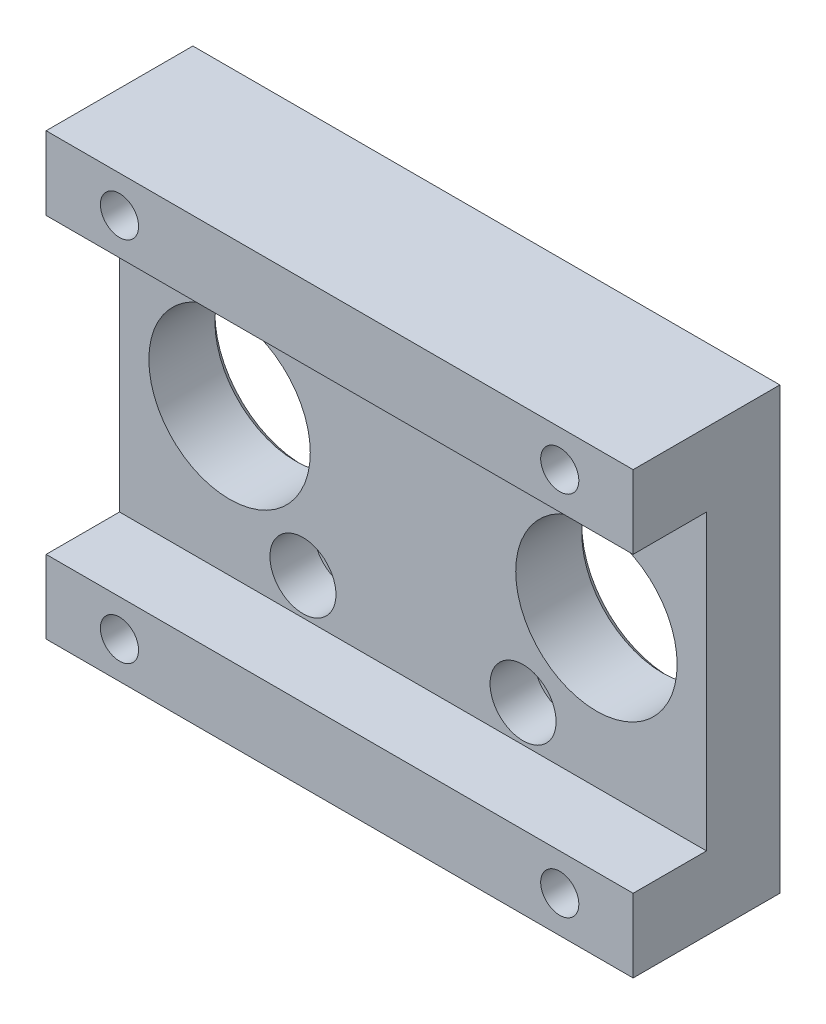
ISO-10303-21;
HEADER;
FILE_DESCRIPTION(('STEP AP214'),'2;1');
FILE_NAME('part.step','',(''),(''),'','','');
FILE_SCHEMA(('AUTOMOTIVE_DESIGN { 1 0 10303 214 1 1 1 1 }'));
ENDSEC;
DATA;
#1=APPLICATION_CONTEXT('core data for automotive mechanical design processes');
#2=APPLICATION_PROTOCOL_DEFINITION('international standard','automotive_design',2000,#1);
#3=PRODUCT_CONTEXT('',#1,'mechanical');
#4=PRODUCT('Part','Part','',(#3));
#5=PRODUCT_RELATED_PRODUCT_CATEGORY('part','',(#4));
#6=PRODUCT_DEFINITION_FORMATION('','',#4);
#7=PRODUCT_DEFINITION_CONTEXT('part definition',#1,'design');
#8=PRODUCT_DEFINITION('design','',#6,#7);
#9=PRODUCT_DEFINITION_SHAPE('','',#8);
#10=(LENGTH_UNIT() NAMED_UNIT(*) SI_UNIT(.MILLI.,.METRE.));
#11=(NAMED_UNIT(*) PLANE_ANGLE_UNIT() SI_UNIT($,.RADIAN.));
#12=(NAMED_UNIT(*) SI_UNIT($,.STERADIAN.) SOLID_ANGLE_UNIT());
#13=UNCERTAINTY_MEASURE_WITH_UNIT(LENGTH_MEASURE(1.E-05),#10,'distance_accuracy_value','');
#14=(GEOMETRIC_REPRESENTATION_CONTEXT(3) GLOBAL_UNCERTAINTY_ASSIGNED_CONTEXT((#13)) GLOBAL_UNIT_ASSIGNED_CONTEXT((#10,
#11,#12)) REPRESENTATION_CONTEXT('',''));
#15=CARTESIAN_POINT('',(0.,0.,0.));
#16=DIRECTION('',(0.,0.,1.));
#17=DIRECTION('',(1.,0.,0.));
#18=AXIS2_PLACEMENT_3D('',#15,#16,#17);
#19=CARTESIAN_POINT('',(15.,15.,10.));
#20=DIRECTION('',(0.,0.,-1.));
#21=DIRECTION('',(-1.,0.,0.));
#22=AXIS2_PLACEMENT_3D('',#19,#20,#21);
#23=CYLINDRICAL_SURFACE('',#22,2.6);
#24=CARTESIAN_POINT('',(15.,15.,0.));
#25=DIRECTION('',(0.,0.,-1.));
#26=DIRECTION('',(-1.,0.,0.));
#27=AXIS2_PLACEMENT_3D('',#24,#25,#26);
#28=CIRCLE('',#27,2.6);
#29=CARTESIAN_POINT('',(12.4,15.,0.));
#30=VERTEX_POINT('',#29);
#31=EDGE_CURVE('E232',#30,#30,#28,.T.);
#32=ORIENTED_EDGE('',*,*,#31,.T.);
#33=EDGE_LOOP('',(#32));
#34=FACE_BOUND('',#33,.T.);
#35=CARTESIAN_POINT('',(15.,15.,4.));
#36=DIRECTION('',(0.,0.,1.));
#37=DIRECTION('',(1.,0.,0.));
#38=AXIS2_PLACEMENT_3D('',#35,#36,#37);
#39=CIRCLE('',#38,2.6);
#40=CARTESIAN_POINT('',(17.6,15.,4.));
#41=VERTEX_POINT('',#40);
#42=EDGE_CURVE('E56',#41,#41,#39,.F.);
#43=ORIENTED_EDGE('',*,*,#42,.F.);
#44=EDGE_LOOP('',(#43));
#45=FACE_BOUND('',#44,.T.);
#46=ADVANCED_FACE('F51',(#34,#45),#23,.F.);
#47=CARTESIAN_POINT('',(-15.,15.,10.));
#48=DIRECTION('',(0.,0.,-1.));
#49=DIRECTION('',(-1.,0.,0.));
#50=AXIS2_PLACEMENT_3D('',#47,#48,#49);
#51=CYLINDRICAL_SURFACE('',#50,2.6);
#52=CARTESIAN_POINT('',(-15.,15.,0.));
#53=DIRECTION('',(0.,0.,-1.));
#54=DIRECTION('',(-1.,0.,0.));
#55=AXIS2_PLACEMENT_3D('',#52,#53,#54);
#56=CIRCLE('',#55,2.6);
#57=CARTESIAN_POINT('',(-17.6,15.,0.));
#58=VERTEX_POINT('',#57);
#59=EDGE_CURVE('E228',#58,#58,#56,.T.);
#60=ORIENTED_EDGE('',*,*,#59,.T.);
#61=EDGE_LOOP('',(#60));
#62=FACE_BOUND('',#61,.T.);
#63=CARTESIAN_POINT('',(-15.,15.,4.));
#64=DIRECTION('',(0.,0.,1.));
#65=DIRECTION('',(1.,0.,0.));
#66=AXIS2_PLACEMENT_3D('',#63,#64,#65);
#67=CIRCLE('',#66,2.6);
#68=CARTESIAN_POINT('',(-12.4,15.,4.));
#69=VERTEX_POINT('',#68);
#70=EDGE_CURVE('E214',#69,#69,#67,.F.);
#71=ORIENTED_EDGE('',*,*,#70,.F.);
#72=EDGE_LOOP('',(#71));
#73=FACE_BOUND('',#72,.T.);
#74=ADVANCED_FACE('F299',(#62,#73),#51,.F.);
#75=CARTESIAN_POINT('',(-15.,-15.,10.));
#76=DIRECTION('',(0.,0.,-1.));
#77=DIRECTION('',(-1.,0.,0.));
#78=AXIS2_PLACEMENT_3D('',#75,#76,#77);
#79=CYLINDRICAL_SURFACE('',#78,2.6);
#80=CARTESIAN_POINT('',(-15.,-15.,0.));
#81=DIRECTION('',(0.,0.,-1.));
#82=DIRECTION('',(-1.,0.,0.));
#83=AXIS2_PLACEMENT_3D('',#80,#81,#82);
#84=CIRCLE('',#83,2.6);
#85=CARTESIAN_POINT('',(-17.6,-15.,0.));
#86=VERTEX_POINT('',#85);
#87=EDGE_CURVE('E223',#86,#86,#84,.T.);
#88=ORIENTED_EDGE('',*,*,#87,.T.);
#89=EDGE_LOOP('',(#88));
#90=FACE_BOUND('',#89,.T.);
#91=CARTESIAN_POINT('',(-15.,-15.,4.));
#92=DIRECTION('',(0.,0.,1.));
#93=DIRECTION('',(1.,0.,0.));
#94=AXIS2_PLACEMENT_3D('',#91,#92,#93);
#95=CIRCLE('',#94,2.6);
#96=CARTESIAN_POINT('',(-12.4,-15.,4.));
#97=VERTEX_POINT('',#96);
#98=EDGE_CURVE('E211',#97,#97,#95,.F.);
#99=ORIENTED_EDGE('',*,*,#98,.F.);
#100=EDGE_LOOP('',(#99));
#101=FACE_BOUND('',#100,.T.);
#102=ADVANCED_FACE('F306',(#90,#101),#79,.F.);
#103=CARTESIAN_POINT('',(15.,-15.,10.));
#104=DIRECTION('',(0.,0.,-1.));
#105=DIRECTION('',(-1.,0.,0.));
#106=AXIS2_PLACEMENT_3D('',#103,#104,#105);
#107=CYLINDRICAL_SURFACE('',#106,2.6);
#108=CARTESIAN_POINT('',(15.,-15.,0.));
#109=DIRECTION('',(0.,0.,-1.));
#110=DIRECTION('',(-1.,0.,0.));
#111=AXIS2_PLACEMENT_3D('',#108,#109,#110);
#112=CIRCLE('',#111,2.6);
#113=CARTESIAN_POINT('',(12.4,-15.,0.));
#114=VERTEX_POINT('',#113);
#115=EDGE_CURVE('E219',#114,#114,#112,.T.);
#116=ORIENTED_EDGE('',*,*,#115,.T.);
#117=EDGE_LOOP('',(#116));
#118=FACE_BOUND('',#117,.T.);
#119=CARTESIAN_POINT('',(15.,-15.,4.));
#120=DIRECTION('',(0.,0.,1.));
#121=DIRECTION('',(1.,0.,0.));
#122=AXIS2_PLACEMENT_3D('',#119,#120,#121);
#123=CIRCLE('',#122,2.6);
#124=CARTESIAN_POINT('',(17.6,-15.,4.));
#125=VERTEX_POINT('',#124);
#126=EDGE_CURVE('E208',#125,#125,#123,.F.);
#127=ORIENTED_EDGE('',*,*,#126,.F.);
#128=EDGE_LOOP('',(#127));
#129=FACE_BOUND('',#128,.T.);
#130=ADVANCED_FACE('F312',(#118,#129),#107,.F.);
#131=CARTESIAN_POINT('',(-30.,-25.,0.));
#132=DIRECTION('',(0.,0.,1.));
#133=DIRECTION('',(1.,0.,0.));
#134=AXIS2_PLACEMENT_3D('',#131,#132,#133);
#135=CYLINDRICAL_SURFACE('',#134,2.6);
#136=CARTESIAN_POINT('',(-30.,-25.,20.));
#137=DIRECTION('',(0.,0.,1.));
#138=DIRECTION('',(1.,0.,0.));
#139=AXIS2_PLACEMENT_3D('',#136,#137,#138);
#140=CIRCLE('',#139,2.6);
#141=CARTESIAN_POINT('',(-27.4,-25.,20.));
#142=VERTEX_POINT('',#141);
#143=EDGE_CURVE('E268',#142,#142,#140,.T.);
#144=ORIENTED_EDGE('',*,*,#143,.T.);
#145=EDGE_LOOP('',(#144));
#146=FACE_BOUND('',#145,.T.);
#147=CARTESIAN_POINT('',(-30.,-25.,5.3));
#148=DIRECTION('',(0.,0.,-1.));
#149=DIRECTION('',(-1.,0.,0.));
#150=AXIS2_PLACEMENT_3D('',#147,#148,#149);
#151=CIRCLE('',#150,2.6);
#152=CARTESIAN_POINT('',(-32.6,-25.,5.3));
#153=VERTEX_POINT('',#152);
#154=EDGE_CURVE('E204',#153,#153,#151,.F.);
#155=ORIENTED_EDGE('',*,*,#154,.F.);
#156=EDGE_LOOP('',(#155));
#157=FACE_BOUND('',#156,.T.);
#158=ADVANCED_FACE('F361',(#146,#157),#135,.F.);
#159=CARTESIAN_POINT('',(30.,-25.,0.));
#160=DIRECTION('',(0.,0.,1.));
#161=DIRECTION('',(1.,0.,0.));
#162=AXIS2_PLACEMENT_3D('',#159,#160,#161);
#163=CYLINDRICAL_SURFACE('',#162,2.6);
#164=CARTESIAN_POINT('',(30.,-25.,20.));
#165=DIRECTION('',(0.,0.,1.));
#166=DIRECTION('',(1.,0.,0.));
#167=AXIS2_PLACEMENT_3D('',#164,#165,#166);
#168=CIRCLE('',#167,2.6);
#169=CARTESIAN_POINT('',(32.6,-25.,20.));
#170=VERTEX_POINT('',#169);
#171=EDGE_CURVE('E261',#170,#170,#168,.T.);
#172=ORIENTED_EDGE('',*,*,#171,.T.);
#173=EDGE_LOOP('',(#172));
#174=FACE_BOUND('',#173,.T.);
#175=CARTESIAN_POINT('',(30.,-25.,5.3));
#176=DIRECTION('',(0.,0.,-1.));
#177=DIRECTION('',(-1.,0.,0.));
#178=AXIS2_PLACEMENT_3D('',#175,#176,#177);
#179=CIRCLE('',#178,2.6);
#180=CARTESIAN_POINT('',(27.4,-25.,5.3));
#181=VERTEX_POINT('',#180);
#182=EDGE_CURVE('E201',#181,#181,#179,.F.);
#183=ORIENTED_EDGE('',*,*,#182,.F.);
#184=EDGE_LOOP('',(#183));
#185=FACE_BOUND('',#184,.T.);
#186=ADVANCED_FACE('F364',(#174,#185),#163,.F.);
#187=CARTESIAN_POINT('',(30.,25.,0.));
#188=DIRECTION('',(0.,0.,1.));
#189=DIRECTION('',(1.,0.,0.));
#190=AXIS2_PLACEMENT_3D('',#187,#188,#189);
#191=CYLINDRICAL_SURFACE('',#190,2.6);
#192=CARTESIAN_POINT('',(30.,25.,20.));
#193=DIRECTION('',(0.,0.,1.));
#194=DIRECTION('',(1.,0.,0.));
#195=AXIS2_PLACEMENT_3D('',#192,#193,#194);
#196=CIRCLE('',#195,2.6);
#197=CARTESIAN_POINT('',(32.6,25.,20.));
#198=VERTEX_POINT('',#197);
#199=EDGE_CURVE('E267',#198,#198,#196,.T.);
#200=ORIENTED_EDGE('',*,*,#199,.T.);
#201=EDGE_LOOP('',(#200));
#202=FACE_BOUND('',#201,.T.);
#203=CARTESIAN_POINT('',(30.,25.,5.3));
#204=DIRECTION('',(0.,0.,-1.));
#205=DIRECTION('',(-1.,0.,0.));
#206=AXIS2_PLACEMENT_3D('',#203,#204,#205);
#207=CIRCLE('',#206,2.6);
#208=CARTESIAN_POINT('',(27.4,25.,5.3));
#209=VERTEX_POINT('',#208);
#210=EDGE_CURVE('E197',#209,#209,#207,.F.);
#211=ORIENTED_EDGE('',*,*,#210,.F.);
#212=EDGE_LOOP('',(#211));
#213=FACE_BOUND('',#212,.T.);
#214=ADVANCED_FACE('F359',(#202,#213),#191,.F.);
#215=CARTESIAN_POINT('',(-30.,25.,0.));
#216=DIRECTION('',(0.,0.,1.));
#217=DIRECTION('',(1.,0.,0.));
#218=AXIS2_PLACEMENT_3D('',#215,#216,#217);
#219=CYLINDRICAL_SURFACE('',#218,2.6);
#220=CARTESIAN_POINT('',(-30.,25.,20.));
#221=DIRECTION('',(0.,0.,1.));
#222=DIRECTION('',(1.,0.,0.));
#223=AXIS2_PLACEMENT_3D('',#220,#221,#222);
#224=CIRCLE('',#223,2.6);
#225=CARTESIAN_POINT('',(-27.4,25.,20.));
#226=VERTEX_POINT('',#225);
#227=EDGE_CURVE('E264',#226,#226,#224,.T.);
#228=ORIENTED_EDGE('',*,*,#227,.T.);
#229=EDGE_LOOP('',(#228));
#230=FACE_BOUND('',#229,.T.);
#231=CARTESIAN_POINT('',(-30.,25.,5.3));
#232=DIRECTION('',(0.,0.,-1.));
#233=DIRECTION('',(-1.,0.,0.));
#234=AXIS2_PLACEMENT_3D('',#231,#232,#233);
#235=CIRCLE('',#234,2.6);
#236=CARTESIAN_POINT('',(-32.6,25.,5.3));
#237=VERTEX_POINT('',#236);
#238=EDGE_CURVE('E194',#237,#237,#235,.F.);
#239=ORIENTED_EDGE('',*,*,#238,.F.);
#240=EDGE_LOOP('',(#239));
#241=FACE_BOUND('',#240,.T.);
#242=ADVANCED_FACE('F355',(#230,#241),#219,.F.);
#243=CARTESIAN_POINT('',(0.,0.,10.));
#244=DIRECTION('',(0.,0.,1.));
#245=DIRECTION('',(1.,0.,0.));
#246=AXIS2_PLACEMENT_3D('',#243,#244,#245);
#247=PLANE('',#246);
#248=CARTESIAN_POINT('',(15.,-15.,10.));
#249=DIRECTION('',(0.,0.,1.));
#250=DIRECTION('',(1.,0.,0.));
#251=AXIS2_PLACEMENT_3D('',#248,#249,#250);
#252=CIRCLE('',#251,4.5);
#253=CARTESIAN_POINT('',(19.5,-15.,10.));
#254=VERTEX_POINT('',#253);
#255=EDGE_CURVE('E431',#254,#254,#252,.T.);
#256=ORIENTED_EDGE('',*,*,#255,.F.);
#257=EDGE_LOOP('',(#256));
#258=FACE_BOUND('',#257,.T.);
#259=CARTESIAN_POINT('',(-15.,-15.,10.));
#260=DIRECTION('',(0.,0.,1.));
#261=DIRECTION('',(1.,0.,0.));
#262=AXIS2_PLACEMENT_3D('',#259,#260,#261);
#263=CIRCLE('',#262,4.5);
#264=CARTESIAN_POINT('',(-10.5,-15.,10.));
#265=VERTEX_POINT('',#264);
#266=EDGE_CURVE('E435',#265,#265,#263,.T.);
#267=ORIENTED_EDGE('',*,*,#266,.F.);
#268=EDGE_LOOP('',(#267));
#269=FACE_BOUND('',#268,.T.);
#270=CARTESIAN_POINT('',(-15.,15.,10.));
#271=DIRECTION('',(0.,0.,1.));
#272=DIRECTION('',(1.,0.,0.));
#273=AXIS2_PLACEMENT_3D('',#270,#271,#272);
#274=CIRCLE('',#273,4.5);
#275=CARTESIAN_POINT('',(-10.5,15.,10.));
#276=VERTEX_POINT('',#275);
#277=EDGE_CURVE('E439',#276,#276,#274,.T.);
#278=ORIENTED_EDGE('',*,*,#277,.F.);
#279=EDGE_LOOP('',(#278));
#280=FACE_BOUND('',#279,.T.);
#281=CARTESIAN_POINT('',(15.,15.,10.));
#282=DIRECTION('',(0.,0.,1.));
#283=DIRECTION('',(1.,0.,0.));
#284=AXIS2_PLACEMENT_3D('',#281,#282,#283);
#285=CIRCLE('',#284,4.5);
#286=CARTESIAN_POINT('',(19.5,15.,10.));
#287=VERTEX_POINT('',#286);
#288=EDGE_CURVE('E443',#287,#287,#285,.T.);
#289=ORIENTED_EDGE('',*,*,#288,.F.);
#290=EDGE_LOOP('',(#289));
#291=FACE_BOUND('',#290,.T.);
#292=CARTESIAN_POINT('',(-25.,0.,10.));
#293=DIRECTION('',(0.,0.,1.));
#294=DIRECTION('',(1.,0.,0.));
#295=AXIS2_PLACEMENT_3D('',#292,#293,#294);
#296=CIRCLE('',#295,11.);
#297=CARTESIAN_POINT('',(-14.,0.,10.));
#298=VERTEX_POINT('',#297);
#299=EDGE_CURVE('E258',#298,#298,#296,.T.);
#300=ORIENTED_EDGE('',*,*,#299,.F.);
#301=EDGE_LOOP('',(#300));
#302=FACE_BOUND('',#301,.T.);
#303=CARTESIAN_POINT('',(25.,0.,10.));
#304=DIRECTION('',(0.,0.,1.));
#305=DIRECTION('',(1.,0.,0.));
#306=AXIS2_PLACEMENT_3D('',#303,#304,#305);
#307=CIRCLE('',#306,11.);
#308=CARTESIAN_POINT('',(36.,0.,10.));
#309=VERTEX_POINT('',#308);
#310=EDGE_CURVE('E207',#309,#309,#307,.T.);
#311=ORIENTED_EDGE('',*,*,#310,.F.);
#312=EDGE_LOOP('',(#311));
#313=FACE_BOUND('',#312,.T.);
#314=DIRECTION('',(0.,-1.,0.));
#315=VECTOR('',#314,1.);
#316=CARTESIAN_POINT('',(-40.,30.,10.));
#317=LINE('',#316,#315);
#318=CARTESIAN_POINT('',(-40.,20.,10.));
#319=VERTEX_POINT('',#318);
#320=CARTESIAN_POINT('',(-40.,-20.,10.));
#321=VERTEX_POINT('',#320);
#322=EDGE_CURVE('E74',#319,#321,#317,.T.);
#323=ORIENTED_EDGE('',*,*,#322,.T.);
#324=DIRECTION('',(-1.,0.,0.));
#325=VECTOR('',#324,1.);
#326=CARTESIAN_POINT('',(40.,-20.,10.));
#327=LINE('',#326,#325);
#328=CARTESIAN_POINT('',(40.,-20.,10.));
#329=VERTEX_POINT('',#328);
#330=EDGE_CURVE('E69',#329,#321,#327,.T.);
#331=ORIENTED_EDGE('',*,*,#330,.F.);
#332=DIRECTION('',(0.,1.,0.));
#333=VECTOR('',#332,1.);
#334=CARTESIAN_POINT('',(40.,30.,10.));
#335=LINE('',#334,#333);
#336=CARTESIAN_POINT('',(40.,20.,10.));
#337=VERTEX_POINT('',#336);
#338=EDGE_CURVE('E170',#329,#337,#335,.T.);
#339=ORIENTED_EDGE('',*,*,#338,.T.);
#340=DIRECTION('',(1.,0.,0.));
#341=VECTOR('',#340,1.);
#342=CARTESIAN_POINT('',(-40.,20.,10.));
#343=LINE('',#342,#341);
#344=EDGE_CURVE('E145',#319,#337,#343,.T.);
#345=ORIENTED_EDGE('',*,*,#344,.F.);
#346=EDGE_LOOP('',(#323,#331,#339,#345));
#347=FACE_BOUND('',#346,.T.);
#348=ADVANCED_FACE('F358',(#258,#269,#280,#291,#302,#313,#347),#247,.T.);
#349=CARTESIAN_POINT('',(40.,30.,10.));
#350=DIRECTION('',(-1.,0.,0.));
#351=DIRECTION('',(0.,-1.,0.));
#352=AXIS2_PLACEMENT_3D('',#349,#350,#351);
#353=PLANE('',#352);
#354=DIRECTION('',(0.,1.,0.));
#355=VECTOR('',#354,1.);
#356=CARTESIAN_POINT('',(40.,30.,0.));
#357=LINE('',#356,#355);
#358=CARTESIAN_POINT('',(40.,-30.,0.));
#359=VERTEX_POINT('',#358);
#360=CARTESIAN_POINT('',(40.,30.,0.));
#361=VERTEX_POINT('',#360);
#362=EDGE_CURVE('E169',#359,#361,#357,.T.);
#363=ORIENTED_EDGE('',*,*,#362,.T.);
#364=DIRECTION('',(0.,0.,-1.));
#365=VECTOR('',#364,1.);
#366=CARTESIAN_POINT('',(40.,30.,10.));
#367=LINE('',#366,#365);
#368=CARTESIAN_POINT('',(40.,30.,20.));
#369=VERTEX_POINT('',#368);
#370=EDGE_CURVE('E183',#369,#361,#367,.T.);
#371=ORIENTED_EDGE('',*,*,#370,.F.);
#372=DIRECTION('',(0.,1.,0.));
#373=VECTOR('',#372,1.);
#374=CARTESIAN_POINT('',(40.,30.,20.));
#375=LINE('',#374,#373);
#376=CARTESIAN_POINT('',(40.,20.,20.));
#377=VERTEX_POINT('',#376);
#378=EDGE_CURVE('E155',#377,#369,#375,.T.);
#379=ORIENTED_EDGE('',*,*,#378,.F.);
#380=DIRECTION('',(0.,0.,-1.));
#381=VECTOR('',#380,1.);
#382=CARTESIAN_POINT('',(40.,20.,20.));
#383=LINE('',#382,#381);
#384=EDGE_CURVE('E161',#377,#337,#383,.T.);
#385=ORIENTED_EDGE('',*,*,#384,.T.);
#386=ORIENTED_EDGE('',*,*,#338,.F.);
#387=DIRECTION('',(0.,0.,-1.));
#388=VECTOR('',#387,1.);
#389=CARTESIAN_POINT('',(40.,-20.,20.));
#390=LINE('',#389,#388);
#391=CARTESIAN_POINT('',(40.,-20.,20.));
#392=VERTEX_POINT('',#391);
#393=EDGE_CURVE('E142',#392,#329,#390,.T.);
#394=ORIENTED_EDGE('',*,*,#393,.F.);
#395=DIRECTION('',(0.,1.,0.));
#396=VECTOR('',#395,1.);
#397=CARTESIAN_POINT('',(40.,-30.,20.));
#398=LINE('',#397,#396);
#399=CARTESIAN_POINT('',(40.,-30.,20.));
#400=VERTEX_POINT('',#399);
#401=EDGE_CURVE('E134',#400,#392,#398,.T.);
#402=ORIENTED_EDGE('',*,*,#401,.F.);
#403=DIRECTION('',(0.,0.,-1.));
#404=VECTOR('',#403,1.);
#405=CARTESIAN_POINT('',(40.,-30.,10.));
#406=LINE('',#405,#404);
#407=EDGE_CURVE('E117',#400,#359,#406,.T.);
#408=ORIENTED_EDGE('',*,*,#407,.T.);
#409=EDGE_LOOP('',(#363,#371,#379,#385,#386,#394,#402,#408));
#410=FACE_BOUND('',#409,.T.);
#411=ADVANCED_FACE('F140',(#410),#353,.F.);
#412=CARTESIAN_POINT('',(-40.,30.,10.));
#413=DIRECTION('',(0.,-1.,0.));
#414=DIRECTION('',(0.,0.,-1.));
#415=AXIS2_PLACEMENT_3D('',#412,#413,#414);
#416=PLANE('',#415);
#417=DIRECTION('',(-1.,0.,0.));
#418=VECTOR('',#417,1.);
#419=CARTESIAN_POINT('',(-40.,30.,0.));
#420=LINE('',#419,#418);
#421=CARTESIAN_POINT('',(-40.,30.,0.));
#422=VERTEX_POINT('',#421);
#423=EDGE_CURVE('E174',#361,#422,#420,.T.);
#424=ORIENTED_EDGE('',*,*,#423,.T.);
#425=DIRECTION('',(0.,0.,-1.));
#426=VECTOR('',#425,1.);
#427=CARTESIAN_POINT('',(-40.,30.,10.));
#428=LINE('',#427,#426);
#429=CARTESIAN_POINT('',(-40.,30.,20.));
#430=VERTEX_POINT('',#429);
#431=EDGE_CURVE('E180',#430,#422,#428,.T.);
#432=ORIENTED_EDGE('',*,*,#431,.F.);
#433=DIRECTION('',(-1.,0.,0.));
#434=VECTOR('',#433,1.);
#435=CARTESIAN_POINT('',(-40.,30.,20.));
#436=LINE('',#435,#434);
#437=EDGE_CURVE('E158',#369,#430,#436,.T.);
#438=ORIENTED_EDGE('',*,*,#437,.F.);
#439=ORIENTED_EDGE('',*,*,#370,.T.);
#440=EDGE_LOOP('',(#424,#432,#438,#439));
#441=FACE_BOUND('',#440,.T.);
#442=ADVANCED_FACE('F384',(#441),#416,.F.);
#443=CARTESIAN_POINT('',(-40.,30.,10.));
#444=DIRECTION('',(1.,0.,0.));
#445=DIRECTION('',(0.,1.,0.));
#446=AXIS2_PLACEMENT_3D('',#443,#444,#445);
#447=PLANE('',#446);
#448=DIRECTION('',(0.,-1.,0.));
#449=VECTOR('',#448,1.);
#450=CARTESIAN_POINT('',(-40.,30.,0.));
#451=LINE('',#450,#449);
#452=CARTESIAN_POINT('',(-40.,-30.,0.));
#453=VERTEX_POINT('',#452);
#454=EDGE_CURVE('E176',#422,#453,#451,.T.);
#455=ORIENTED_EDGE('',*,*,#454,.T.);
#456=DIRECTION('',(0.,0.,-1.));
#457=VECTOR('',#456,1.);
#458=CARTESIAN_POINT('',(-40.,-30.,10.));
#459=LINE('',#458,#457);
#460=CARTESIAN_POINT('',(-40.,-30.,20.));
#461=VERTEX_POINT('',#460);
#462=EDGE_CURVE('E128',#461,#453,#459,.T.);
#463=ORIENTED_EDGE('',*,*,#462,.F.);
#464=DIRECTION('',(0.,-1.,0.));
#465=VECTOR('',#464,1.);
#466=CARTESIAN_POINT('',(-40.,-30.,20.));
#467=LINE('',#466,#465);
#468=CARTESIAN_POINT('',(-40.,-20.,20.));
#469=VERTEX_POINT('',#468);
#470=EDGE_CURVE('E137',#469,#461,#467,.T.);
#471=ORIENTED_EDGE('',*,*,#470,.F.);
#472=DIRECTION('',(0.,0.,-1.));
#473=VECTOR('',#472,1.);
#474=CARTESIAN_POINT('',(-40.,-20.,20.));
#475=LINE('',#474,#473);
#476=EDGE_CURVE('E138',#469,#321,#475,.T.);
#477=ORIENTED_EDGE('',*,*,#476,.T.);
#478=ORIENTED_EDGE('',*,*,#322,.F.);
#479=DIRECTION('',(0.,0.,-1.));
#480=VECTOR('',#479,1.);
#481=CARTESIAN_POINT('',(-40.,20.,20.));
#482=LINE('',#481,#480);
#483=CARTESIAN_POINT('',(-40.,20.,20.));
#484=VERTEX_POINT('',#483);
#485=EDGE_CURVE('E166',#484,#319,#482,.T.);
#486=ORIENTED_EDGE('',*,*,#485,.F.);
#487=DIRECTION('',(0.,-1.,0.));
#488=VECTOR('',#487,1.);
#489=CARTESIAN_POINT('',(-40.,30.,20.));
#490=LINE('',#489,#488);
#491=EDGE_CURVE('E150',#430,#484,#490,.T.);
#492=ORIENTED_EDGE('',*,*,#491,.F.);
#493=ORIENTED_EDGE('',*,*,#431,.T.);
#494=EDGE_LOOP('',(#455,#463,#471,#477,#478,#486,#492,#493));
#495=FACE_BOUND('',#494,.T.);
#496=ADVANCED_FACE('F279',(#495),#447,.F.);
#497=CARTESIAN_POINT('',(-40.,-30.,10.));
#498=DIRECTION('',(0.,1.,0.));
#499=DIRECTION('',(0.,0.,1.));
#500=AXIS2_PLACEMENT_3D('',#497,#498,#499);
#501=PLANE('',#500);
#502=DIRECTION('',(1.,0.,0.));
#503=VECTOR('',#502,1.);
#504=CARTESIAN_POINT('',(-40.,-30.,0.));
#505=LINE('',#504,#503);
#506=EDGE_CURVE('E123',#453,#359,#505,.T.);
#507=ORIENTED_EDGE('',*,*,#506,.T.);
#508=ORIENTED_EDGE('',*,*,#407,.F.);
#509=DIRECTION('',(1.,0.,0.));
#510=VECTOR('',#509,1.);
#511=CARTESIAN_POINT('',(40.,-30.,20.));
#512=LINE('',#511,#510);
#513=EDGE_CURVE('E121',#461,#400,#512,.T.);
#514=ORIENTED_EDGE('',*,*,#513,.F.);
#515=ORIENTED_EDGE('',*,*,#462,.T.);
#516=EDGE_LOOP('',(#507,#508,#514,#515));
#517=FACE_BOUND('',#516,.T.);
#518=ADVANCED_FACE('F119',(#517),#501,.F.);
#519=CARTESIAN_POINT('',(0.,0.,0.));
#520=DIRECTION('',(0.,0.,1.));
#521=DIRECTION('',(1.,0.,0.));
#522=AXIS2_PLACEMENT_3D('',#519,#520,#521);
#523=PLANE('',#522);
#524=ORIENTED_EDGE('',*,*,#115,.F.);
#525=EDGE_LOOP('',(#524));
#526=FACE_BOUND('',#525,.T.);
#527=ORIENTED_EDGE('',*,*,#87,.F.);
#528=EDGE_LOOP('',(#527));
#529=FACE_BOUND('',#528,.T.);
#530=ORIENTED_EDGE('',*,*,#59,.F.);
#531=EDGE_LOOP('',(#530));
#532=FACE_BOUND('',#531,.T.);
#533=ORIENTED_EDGE('',*,*,#31,.F.);
#534=EDGE_LOOP('',(#533));
#535=FACE_BOUND('',#534,.T.);
#536=CARTESIAN_POINT('',(30.,-25.,0.));
#537=DIRECTION('',(0.,0.,-1.));
#538=DIRECTION('',(-1.,0.,0.));
#539=AXIS2_PLACEMENT_3D('',#536,#537,#538);
#540=CIRCLE('',#539,4.5);
#541=CARTESIAN_POINT('',(25.5,-25.,0.));
#542=VERTEX_POINT('',#541);
#543=EDGE_CURVE('E249',#542,#542,#540,.T.);
#544=ORIENTED_EDGE('',*,*,#543,.F.);
#545=EDGE_LOOP('',(#544));
#546=FACE_BOUND('',#545,.T.);
#547=CARTESIAN_POINT('',(-30.,-25.,0.));
#548=DIRECTION('',(0.,0.,-1.));
#549=DIRECTION('',(-1.,0.,0.));
#550=AXIS2_PLACEMENT_3D('',#547,#548,#549);
#551=CIRCLE('',#550,4.5);
#552=CARTESIAN_POINT('',(-34.5,-25.,0.));
#553=VERTEX_POINT('',#552);
#554=EDGE_CURVE('E243',#553,#553,#551,.T.);
#555=ORIENTED_EDGE('',*,*,#554,.F.);
#556=EDGE_LOOP('',(#555));
#557=FACE_BOUND('',#556,.T.);
#558=CARTESIAN_POINT('',(-30.,25.,0.));
#559=DIRECTION('',(0.,0.,-1.));
#560=DIRECTION('',(-1.,0.,0.));
#561=AXIS2_PLACEMENT_3D('',#558,#559,#560);
#562=CIRCLE('',#561,4.5);
#563=CARTESIAN_POINT('',(-34.5,25.,0.));
#564=VERTEX_POINT('',#563);
#565=EDGE_CURVE('E236',#564,#564,#562,.T.);
#566=ORIENTED_EDGE('',*,*,#565,.F.);
#567=EDGE_LOOP('',(#566));
#568=FACE_BOUND('',#567,.T.);
#569=CARTESIAN_POINT('',(30.,25.,0.));
#570=DIRECTION('',(0.,0.,-1.));
#571=DIRECTION('',(-1.,0.,0.));
#572=AXIS2_PLACEMENT_3D('',#569,#570,#571);
#573=CIRCLE('',#572,4.5);
#574=CARTESIAN_POINT('',(25.5,25.,0.));
#575=VERTEX_POINT('',#574);
#576=EDGE_CURVE('E239',#575,#575,#573,.T.);
#577=ORIENTED_EDGE('',*,*,#576,.F.);
#578=EDGE_LOOP('',(#577));
#579=FACE_BOUND('',#578,.T.);
#580=CARTESIAN_POINT('',(25.,0.,0.));
#581=DIRECTION('',(0.,0.,1.));
#582=DIRECTION('',(1.,0.,0.));
#583=AXIS2_PLACEMENT_3D('',#580,#581,#582);
#584=CIRCLE('',#583,12.);
#585=CARTESIAN_POINT('',(37.,0.,0.));
#586=VERTEX_POINT('',#585);
#587=EDGE_CURVE('E189',#586,#586,#584,.T.);
#588=ORIENTED_EDGE('',*,*,#587,.T.);
#589=EDGE_LOOP('',(#588));
#590=FACE_BOUND('',#589,.T.);
#591=CARTESIAN_POINT('',(-25.,0.,0.));
#592=DIRECTION('',(0.,0.,1.));
#593=DIRECTION('',(1.,0.,0.));
#594=AXIS2_PLACEMENT_3D('',#591,#592,#593);
#595=CIRCLE('',#594,12.);
#596=CARTESIAN_POINT('',(-13.,0.,0.));
#597=VERTEX_POINT('',#596);
#598=EDGE_CURVE('E186',#597,#597,#595,.T.);
#599=ORIENTED_EDGE('',*,*,#598,.T.);
#600=EDGE_LOOP('',(#599));
#601=FACE_BOUND('',#600,.T.);
#602=ORIENTED_EDGE('',*,*,#362,.F.);
#603=ORIENTED_EDGE('',*,*,#506,.F.);
#604=ORIENTED_EDGE('',*,*,#454,.F.);
#605=ORIENTED_EDGE('',*,*,#423,.F.);
#606=EDGE_LOOP('',(#602,#603,#604,#605));
#607=FACE_BOUND('',#606,.T.);
#608=ADVANCED_FACE('F387',(#526,#529,#532,#535,#546,#557,#568,#579,#590,#601,#607),#523,.F.);
#609=CARTESIAN_POINT('',(-40.,20.,20.));
#610=DIRECTION('',(0.,1.,0.));
#611=DIRECTION('',(-1.,0.,0.));
#612=AXIS2_PLACEMENT_3D('',#609,#610,#611);
#613=PLANE('',#612);
#614=ORIENTED_EDGE('',*,*,#344,.T.);
#615=ORIENTED_EDGE('',*,*,#384,.F.);
#616=DIRECTION('',(1.,0.,0.));
#617=VECTOR('',#616,1.);
#618=CARTESIAN_POINT('',(-40.,20.,20.));
#619=LINE('',#618,#617);
#620=EDGE_CURVE('E153',#484,#377,#619,.T.);
#621=ORIENTED_EDGE('',*,*,#620,.F.);
#622=ORIENTED_EDGE('',*,*,#485,.T.);
#623=EDGE_LOOP('',(#614,#615,#621,#622));
#624=FACE_BOUND('',#623,.T.);
#625=ADVANCED_FACE('F294',(#624),#613,.F.);
#626=CARTESIAN_POINT('',(0.,0.,20.));
#627=DIRECTION('',(0.,0.,1.));
#628=DIRECTION('',(1.,0.,0.));
#629=AXIS2_PLACEMENT_3D('',#626,#627,#628);
#630=PLANE('',#629);
#631=ORIENTED_EDGE('',*,*,#227,.F.);
#632=EDGE_LOOP('',(#631));
#633=FACE_BOUND('',#632,.T.);
#634=ORIENTED_EDGE('',*,*,#199,.F.);
#635=EDGE_LOOP('',(#634));
#636=FACE_BOUND('',#635,.T.);
#637=ORIENTED_EDGE('',*,*,#491,.T.);
#638=ORIENTED_EDGE('',*,*,#620,.T.);
#639=ORIENTED_EDGE('',*,*,#378,.T.);
#640=ORIENTED_EDGE('',*,*,#437,.T.);
#641=EDGE_LOOP('',(#637,#638,#639,#640));
#642=FACE_BOUND('',#641,.T.);
#643=ADVANCED_FACE('F284',(#633,#636,#642),#630,.T.);
#644=CARTESIAN_POINT('',(40.,-20.,20.));
#645=DIRECTION('',(0.,-1.,0.));
#646=DIRECTION('',(1.,0.,0.));
#647=AXIS2_PLACEMENT_3D('',#644,#645,#646);
#648=PLANE('',#647);
#649=ORIENTED_EDGE('',*,*,#330,.T.);
#650=ORIENTED_EDGE('',*,*,#476,.F.);
#651=DIRECTION('',(-1.,0.,0.));
#652=VECTOR('',#651,1.);
#653=CARTESIAN_POINT('',(40.,-20.,20.));
#654=LINE('',#653,#652);
#655=EDGE_CURVE('E143',#392,#469,#654,.T.);
#656=ORIENTED_EDGE('',*,*,#655,.F.);
#657=ORIENTED_EDGE('',*,*,#393,.T.);
#658=EDGE_LOOP('',(#649,#650,#656,#657));
#659=FACE_BOUND('',#658,.T.);
#660=ADVANCED_FACE('F282',(#659),#648,.F.);
#661=CARTESIAN_POINT('',(0.,0.,20.));
#662=DIRECTION('',(0.,0.,1.));
#663=DIRECTION('',(1.,0.,0.));
#664=AXIS2_PLACEMENT_3D('',#661,#662,#663);
#665=PLANE('',#664);
#666=ORIENTED_EDGE('',*,*,#171,.F.);
#667=EDGE_LOOP('',(#666));
#668=FACE_BOUND('',#667,.T.);
#669=ORIENTED_EDGE('',*,*,#143,.F.);
#670=EDGE_LOOP('',(#669));
#671=FACE_BOUND('',#670,.T.);
#672=ORIENTED_EDGE('',*,*,#401,.T.);
#673=ORIENTED_EDGE('',*,*,#655,.T.);
#674=ORIENTED_EDGE('',*,*,#470,.T.);
#675=ORIENTED_EDGE('',*,*,#513,.T.);
#676=EDGE_LOOP('',(#672,#673,#674,#675));
#677=FACE_BOUND('',#676,.T.);
#678=ADVANCED_FACE('F133',(#668,#671,#677),#665,.T.);
#679=CARTESIAN_POINT('',(25.,0.,-2.2));
#680=DIRECTION('',(0.,0.,1.));
#681=DIRECTION('',(1.,0.,0.));
#682=AXIS2_PLACEMENT_3D('',#679,#680,#681);
#683=CYLINDRICAL_SURFACE('',#682,11.);
#684=CARTESIAN_POINT('',(25.,0.,0.999999999999989));
#685=DIRECTION('',(0.,0.,1.));
#686=DIRECTION('',(1.,0.,0.));
#687=AXIS2_PLACEMENT_3D('',#684,#685,#686);
#688=CIRCLE('',#687,11.);
#689=CARTESIAN_POINT('',(36.,0.,0.999999999999989));
#690=VERTEX_POINT('',#689);
#691=EDGE_CURVE('E61',#690,#690,#688,.F.);
#692=ORIENTED_EDGE('',*,*,#691,.T.);
#693=EDGE_LOOP('',(#692));
#694=FACE_BOUND('',#693,.T.);
#695=ORIENTED_EDGE('',*,*,#310,.T.);
#696=EDGE_LOOP('',(#695));
#697=FACE_BOUND('',#696,.T.);
#698=ADVANCED_FACE('F291',(#694,#697),#683,.F.);
#699=CARTESIAN_POINT('',(-25.,0.,-2.2));
#700=DIRECTION('',(0.,0.,1.));
#701=DIRECTION('',(1.,0.,0.));
#702=AXIS2_PLACEMENT_3D('',#699,#700,#701);
#703=CYLINDRICAL_SURFACE('',#702,11.);
#704=CARTESIAN_POINT('',(-25.,0.,0.999999999999987));
#705=DIRECTION('',(0.,0.,1.));
#706=DIRECTION('',(1.,0.,0.));
#707=AXIS2_PLACEMENT_3D('',#704,#705,#706);
#708=CIRCLE('',#707,11.);
#709=CARTESIAN_POINT('',(-14.,0.,0.999999999999987));
#710=VERTEX_POINT('',#709);
#711=EDGE_CURVE('E11',#710,#710,#708,.F.);
#712=ORIENTED_EDGE('',*,*,#711,.T.);
#713=EDGE_LOOP('',(#712));
#714=FACE_BOUND('',#713,.T.);
#715=ORIENTED_EDGE('',*,*,#299,.T.);
#716=EDGE_LOOP('',(#715));
#717=FACE_BOUND('',#716,.T.);
#718=ADVANCED_FACE('F347',(#714,#717),#703,.F.);
#719=CARTESIAN_POINT('',(25.,0.,0.));
#720=DIRECTION('',(0.,0.,-1.));
#721=DIRECTION('',(-1.,0.,0.));
#722=AXIS2_PLACEMENT_3D('',#719,#720,#721);
#723=CONICAL_SURFACE('',#722,12.,0.785398163397447);
#724=ORIENTED_EDGE('',*,*,#691,.F.);
#725=EDGE_LOOP('',(#724));
#726=FACE_BOUND('',#725,.T.);
#727=ORIENTED_EDGE('',*,*,#587,.F.);
#728=EDGE_LOOP('',(#727));
#729=FACE_BOUND('',#728,.T.);
#730=ADVANCED_FACE('F350',(#726,#729),#723,.F.);
#731=CARTESIAN_POINT('',(-25.,0.,0.));
#732=DIRECTION('',(0.,0.,-1.));
#733=DIRECTION('',(-1.,0.,0.));
#734=AXIS2_PLACEMENT_3D('',#731,#732,#733);
#735=CONICAL_SURFACE('',#734,12.,0.785398163397447);
#736=ORIENTED_EDGE('',*,*,#711,.F.);
#737=EDGE_LOOP('',(#736));
#738=FACE_BOUND('',#737,.T.);
#739=ORIENTED_EDGE('',*,*,#598,.F.);
#740=EDGE_LOOP('',(#739));
#741=FACE_BOUND('',#740,.T.);
#742=ADVANCED_FACE('F54',(#738,#741),#735,.F.);
#743=CARTESIAN_POINT('',(-30.,25.,5.3));
#744=DIRECTION('',(0.,0.,-1.));
#745=DIRECTION('',(-1.,0.,0.));
#746=AXIS2_PLACEMENT_3D('',#743,#744,#745);
#747=PLANE('',#746);
#748=CARTESIAN_POINT('',(-30.,25.,5.3));
#749=DIRECTION('',(0.,0.,-1.));
#750=DIRECTION('',(-1.,0.,0.));
#751=AXIS2_PLACEMENT_3D('',#748,#749,#750);
#752=CIRCLE('',#751,4.5);
#753=CARTESIAN_POINT('',(-34.5,25.,5.3));
#754=VERTEX_POINT('',#753);
#755=EDGE_CURVE('E240',#754,#754,#752,.T.);
#756=ORIENTED_EDGE('',*,*,#755,.T.);
#757=EDGE_LOOP('',(#756));
#758=FACE_BOUND('',#757,.T.);
#759=ORIENTED_EDGE('',*,*,#238,.T.);
#760=EDGE_LOOP('',(#759));
#761=FACE_BOUND('',#760,.T.);
#762=ADVANCED_FACE('F318',(#758,#761),#747,.T.);
#763=CARTESIAN_POINT('',(-30.,25.,5.3));
#764=DIRECTION('',(0.,0.,-1.));
#765=DIRECTION('',(-1.,0.,0.));
#766=AXIS2_PLACEMENT_3D('',#763,#764,#765);
#767=CYLINDRICAL_SURFACE('',#766,4.5);
#768=ORIENTED_EDGE('',*,*,#755,.F.);
#769=EDGE_LOOP('',(#768));
#770=FACE_BOUND('',#769,.T.);
#771=ORIENTED_EDGE('',*,*,#565,.T.);
#772=EDGE_LOOP('',(#771));
#773=FACE_BOUND('',#772,.T.);
#774=ADVANCED_FACE('F314',(#770,#773),#767,.F.);
#775=CARTESIAN_POINT('',(30.,25.,5.3));
#776=DIRECTION('',(0.,0.,-1.));
#777=DIRECTION('',(-1.,0.,0.));
#778=AXIS2_PLACEMENT_3D('',#775,#776,#777);
#779=PLANE('',#778);
#780=CARTESIAN_POINT('',(30.,25.,5.3));
#781=DIRECTION('',(0.,0.,-1.));
#782=DIRECTION('',(-1.,0.,0.));
#783=AXIS2_PLACEMENT_3D('',#780,#781,#782);
#784=CIRCLE('',#783,4.5);
#785=CARTESIAN_POINT('',(25.5,25.,5.3));
#786=VERTEX_POINT('',#785);
#787=EDGE_CURVE('E198',#786,#786,#784,.T.);
#788=ORIENTED_EDGE('',*,*,#787,.T.);
#789=EDGE_LOOP('',(#788));
#790=FACE_BOUND('',#789,.T.);
#791=ORIENTED_EDGE('',*,*,#210,.T.);
#792=EDGE_LOOP('',(#791));
#793=FACE_BOUND('',#792,.T.);
#794=ADVANCED_FACE('F317',(#790,#793),#779,.T.);
#795=CARTESIAN_POINT('',(30.,25.,5.3));
#796=DIRECTION('',(0.,0.,-1.));
#797=DIRECTION('',(-1.,0.,0.));
#798=AXIS2_PLACEMENT_3D('',#795,#796,#797);
#799=CYLINDRICAL_SURFACE('',#798,4.5);
#800=ORIENTED_EDGE('',*,*,#787,.F.);
#801=EDGE_LOOP('',(#800));
#802=FACE_BOUND('',#801,.T.);
#803=ORIENTED_EDGE('',*,*,#576,.T.);
#804=EDGE_LOOP('',(#803));
#805=FACE_BOUND('',#804,.T.);
#806=ADVANCED_FACE('F339',(#802,#805),#799,.F.);
#807=CARTESIAN_POINT('',(30.,-25.,5.3));
#808=DIRECTION('',(0.,0.,-1.));
#809=DIRECTION('',(-1.,0.,0.));
#810=AXIS2_PLACEMENT_3D('',#807,#808,#809);
#811=PLANE('',#810);
#812=CARTESIAN_POINT('',(30.,-25.,5.3));
#813=DIRECTION('',(0.,0.,-1.));
#814=DIRECTION('',(-1.,0.,0.));
#815=AXIS2_PLACEMENT_3D('',#812,#813,#814);
#816=CIRCLE('',#815,4.5);
#817=CARTESIAN_POINT('',(25.5,-25.,5.3));
#818=VERTEX_POINT('',#817);
#819=EDGE_CURVE('E235',#818,#818,#816,.T.);
#820=ORIENTED_EDGE('',*,*,#819,.T.);
#821=EDGE_LOOP('',(#820));
#822=FACE_BOUND('',#821,.T.);
#823=ORIENTED_EDGE('',*,*,#182,.T.);
#824=EDGE_LOOP('',(#823));
#825=FACE_BOUND('',#824,.T.);
#826=ADVANCED_FACE('F335',(#822,#825),#811,.T.);
#827=CARTESIAN_POINT('',(30.,-25.,5.3));
#828=DIRECTION('',(0.,0.,-1.));
#829=DIRECTION('',(-1.,0.,0.));
#830=AXIS2_PLACEMENT_3D('',#827,#828,#829);
#831=CYLINDRICAL_SURFACE('',#830,4.5);
#832=ORIENTED_EDGE('',*,*,#819,.F.);
#833=EDGE_LOOP('',(#832));
#834=FACE_BOUND('',#833,.T.);
#835=ORIENTED_EDGE('',*,*,#543,.T.);
#836=EDGE_LOOP('',(#835));
#837=FACE_BOUND('',#836,.T.);
#838=ADVANCED_FACE('F331',(#834,#837),#831,.F.);
#839=CARTESIAN_POINT('',(-30.,-25.,5.3));
#840=DIRECTION('',(0.,0.,-1.));
#841=DIRECTION('',(-1.,0.,0.));
#842=AXIS2_PLACEMENT_3D('',#839,#840,#841);
#843=PLANE('',#842);
#844=CARTESIAN_POINT('',(-30.,-25.,5.3));
#845=DIRECTION('',(0.,0.,-1.));
#846=DIRECTION('',(-1.,0.,0.));
#847=AXIS2_PLACEMENT_3D('',#844,#845,#846);
#848=CIRCLE('',#847,4.5);
#849=CARTESIAN_POINT('',(-34.5,-25.,5.3));
#850=VERTEX_POINT('',#849);
#851=EDGE_CURVE('E246',#850,#850,#848,.T.);
#852=ORIENTED_EDGE('',*,*,#851,.T.);
#853=EDGE_LOOP('',(#852));
#854=FACE_BOUND('',#853,.T.);
#855=ORIENTED_EDGE('',*,*,#154,.T.);
#856=EDGE_LOOP('',(#855));
#857=FACE_BOUND('',#856,.T.);
#858=ADVANCED_FACE('F327',(#854,#857),#843,.T.);
#859=CARTESIAN_POINT('',(-30.,-25.,5.3));
#860=DIRECTION('',(0.,0.,-1.));
#861=DIRECTION('',(-1.,0.,0.));
#862=AXIS2_PLACEMENT_3D('',#859,#860,#861);
#863=CYLINDRICAL_SURFACE('',#862,4.5);
#864=ORIENTED_EDGE('',*,*,#851,.F.);
#865=EDGE_LOOP('',(#864));
#866=FACE_BOUND('',#865,.T.);
#867=ORIENTED_EDGE('',*,*,#554,.T.);
#868=EDGE_LOOP('',(#867));
#869=FACE_BOUND('',#868,.T.);
#870=ADVANCED_FACE('F323',(#866,#869),#863,.F.);
#871=CARTESIAN_POINT('',(15.,-15.,4.));
#872=DIRECTION('',(0.,0.,1.));
#873=DIRECTION('',(1.,0.,0.));
#874=AXIS2_PLACEMENT_3D('',#871,#872,#873);
#875=PLANE('',#874);
#876=CARTESIAN_POINT('',(15.,-15.,4.));
#877=DIRECTION('',(0.,0.,1.));
#878=DIRECTION('',(1.,0.,0.));
#879=AXIS2_PLACEMENT_3D('',#876,#877,#878);
#880=CIRCLE('',#879,4.5);
#881=CARTESIAN_POINT('',(19.5,-15.,4.));
#882=VERTEX_POINT('',#881);
#883=EDGE_CURVE('E471',#882,#882,#880,.T.);
#884=ORIENTED_EDGE('',*,*,#883,.T.);
#885=EDGE_LOOP('',(#884));
#886=FACE_BOUND('',#885,.T.);
#887=ORIENTED_EDGE('',*,*,#126,.T.);
#888=EDGE_LOOP('',(#887));
#889=FACE_BOUND('',#888,.T.);
#890=ADVANCED_FACE('F326',(#886,#889),#875,.T.);
#891=CARTESIAN_POINT('',(15.,-15.,4.));
#892=DIRECTION('',(0.,0.,1.));
#893=DIRECTION('',(1.,0.,0.));
#894=AXIS2_PLACEMENT_3D('',#891,#892,#893);
#895=CYLINDRICAL_SURFACE('',#894,4.5);
#896=ORIENTED_EDGE('',*,*,#883,.F.);
#897=EDGE_LOOP('',(#896));
#898=FACE_BOUND('',#897,.T.);
#899=ORIENTED_EDGE('',*,*,#255,.T.);
#900=EDGE_LOOP('',(#899));
#901=FACE_BOUND('',#900,.T.);
#902=ADVANCED_FACE('F505',(#898,#901),#895,.F.);
#903=CARTESIAN_POINT('',(-15.,-15.,4.));
#904=DIRECTION('',(0.,0.,1.));
#905=DIRECTION('',(1.,0.,0.));
#906=AXIS2_PLACEMENT_3D('',#903,#904,#905);
#907=PLANE('',#906);
#908=CARTESIAN_POINT('',(-15.,-15.,4.));
#909=DIRECTION('',(0.,0.,1.));
#910=DIRECTION('',(1.,0.,0.));
#911=AXIS2_PLACEMENT_3D('',#908,#909,#910);
#912=CIRCLE('',#911,4.5);
#913=CARTESIAN_POINT('',(-10.5,-15.,4.));
#914=VERTEX_POINT('',#913);
#915=EDGE_CURVE('E475',#914,#914,#912,.T.);
#916=ORIENTED_EDGE('',*,*,#915,.T.);
#917=EDGE_LOOP('',(#916));
#918=FACE_BOUND('',#917,.T.);
#919=ORIENTED_EDGE('',*,*,#98,.T.);
#920=EDGE_LOOP('',(#919));
#921=FACE_BOUND('',#920,.T.);
#922=ADVANCED_FACE('F501',(#918,#921),#907,.T.);
#923=CARTESIAN_POINT('',(-15.,-15.,4.));
#924=DIRECTION('',(0.,0.,1.));
#925=DIRECTION('',(1.,0.,0.));
#926=AXIS2_PLACEMENT_3D('',#923,#924,#925);
#927=CYLINDRICAL_SURFACE('',#926,4.5);
#928=ORIENTED_EDGE('',*,*,#915,.F.);
#929=EDGE_LOOP('',(#928));
#930=FACE_BOUND('',#929,.T.);
#931=ORIENTED_EDGE('',*,*,#266,.T.);
#932=EDGE_LOOP('',(#931));
#933=FACE_BOUND('',#932,.T.);
#934=ADVANCED_FACE('F496',(#930,#933),#927,.F.);
#935=CARTESIAN_POINT('',(-15.,15.,4.));
#936=DIRECTION('',(0.,0.,1.));
#937=DIRECTION('',(1.,0.,0.));
#938=AXIS2_PLACEMENT_3D('',#935,#936,#937);
#939=PLANE('',#938);
#940=CARTESIAN_POINT('',(-15.,15.,4.));
#941=DIRECTION('',(0.,0.,1.));
#942=DIRECTION('',(1.,0.,0.));
#943=AXIS2_PLACEMENT_3D('',#940,#941,#942);
#944=CIRCLE('',#943,4.5);
#945=CARTESIAN_POINT('',(-10.5,15.,4.));
#946=VERTEX_POINT('',#945);
#947=EDGE_CURVE('E450',#946,#946,#944,.T.);
#948=ORIENTED_EDGE('',*,*,#947,.T.);
#949=EDGE_LOOP('',(#948));
#950=FACE_BOUND('',#949,.T.);
#951=ORIENTED_EDGE('',*,*,#70,.T.);
#952=EDGE_LOOP('',(#951));
#953=FACE_BOUND('',#952,.T.);
#954=ADVANCED_FACE('F482',(#950,#953),#939,.T.);
#955=CARTESIAN_POINT('',(-15.,15.,4.));
#956=DIRECTION('',(0.,0.,1.));
#957=DIRECTION('',(1.,0.,0.));
#958=AXIS2_PLACEMENT_3D('',#955,#956,#957);
#959=CYLINDRICAL_SURFACE('',#958,4.5);
#960=ORIENTED_EDGE('',*,*,#947,.F.);
#961=EDGE_LOOP('',(#960));
#962=FACE_BOUND('',#961,.T.);
#963=ORIENTED_EDGE('',*,*,#277,.T.);
#964=EDGE_LOOP('',(#963));
#965=FACE_BOUND('',#964,.T.);
#966=ADVANCED_FACE('F484',(#962,#965),#959,.F.);
#967=CARTESIAN_POINT('',(15.,15.,4.));
#968=DIRECTION('',(0.,0.,1.));
#969=DIRECTION('',(1.,0.,0.));
#970=AXIS2_PLACEMENT_3D('',#967,#968,#969);
#971=PLANE('',#970);
#972=CARTESIAN_POINT('',(15.,15.,4.));
#973=DIRECTION('',(0.,0.,1.));
#974=DIRECTION('',(1.,0.,0.));
#975=AXIS2_PLACEMENT_3D('',#972,#973,#974);
#976=CIRCLE('',#975,4.5);
#977=CARTESIAN_POINT('',(19.5,15.,4.));
#978=VERTEX_POINT('',#977);
#979=EDGE_CURVE('E212',#978,#978,#976,.T.);
#980=ORIENTED_EDGE('',*,*,#979,.T.);
#981=EDGE_LOOP('',(#980));
#982=FACE_BOUND('',#981,.T.);
#983=ORIENTED_EDGE('',*,*,#42,.T.);
#984=EDGE_LOOP('',(#983));
#985=FACE_BOUND('',#984,.T.);
#986=ADVANCED_FACE('F487',(#982,#985),#971,.T.);
#987=CARTESIAN_POINT('',(15.,15.,4.));
#988=DIRECTION('',(0.,0.,1.));
#989=DIRECTION('',(1.,0.,0.));
#990=AXIS2_PLACEMENT_3D('',#987,#988,#989);
#991=CYLINDRICAL_SURFACE('',#990,4.5);
#992=ORIENTED_EDGE('',*,*,#979,.F.);
#993=EDGE_LOOP('',(#992));
#994=FACE_BOUND('',#993,.T.);
#995=ORIENTED_EDGE('',*,*,#288,.T.);
#996=EDGE_LOOP('',(#995));
#997=FACE_BOUND('',#996,.T.);
#998=ADVANCED_FACE('F493',(#994,#997),#991,.F.);
#999=CLOSED_SHELL('',(#46,#74,#102,#130,#158,#186,#214,#242,#348,#411,#442,#496,#518,#608,#625,
#643,#660,#678,#698,#718,#730,#742,#762,#774,#794,#806,#826,#838,#858,#870,#890,#902,#922,#934,
#954,#966,#986,#998));
#1000=MANIFOLD_SOLID_BREP('B2',#999);
#1001=ADVANCED_BREP_SHAPE_REPRESENTATION('',(#18,#1000),#14);
#1002=SHAPE_DEFINITION_REPRESENTATION(#9,#1001);
ENDSEC;
END-ISO-10303-21;
